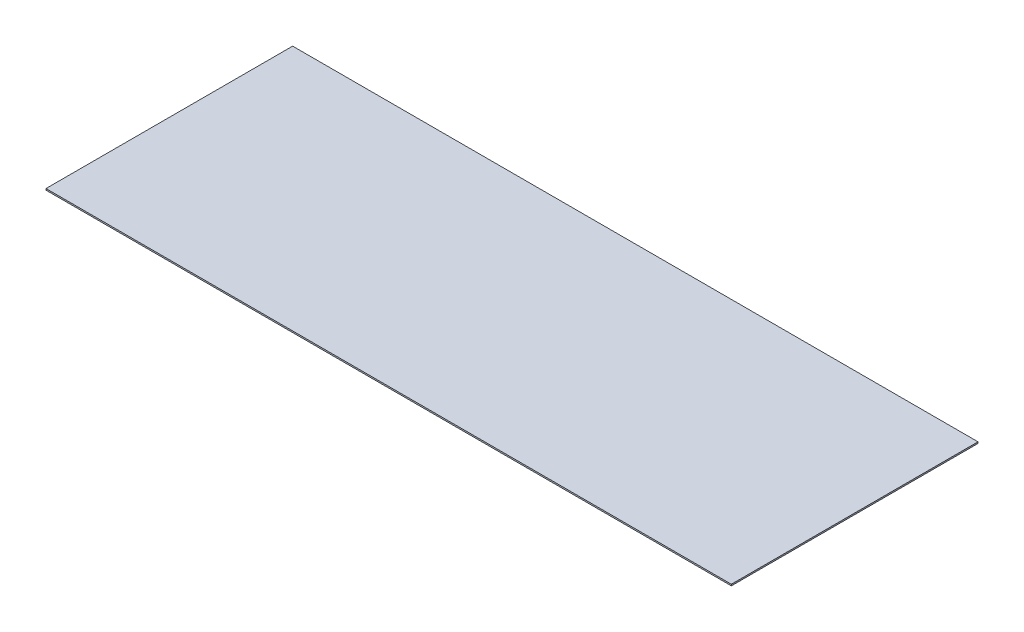
ISO-10303-21;
HEADER;
FILE_DESCRIPTION(('STEP AP214'),'2;1');
FILE_NAME('part.step','',(''),(''),'','','');
FILE_SCHEMA(('AUTOMOTIVE_DESIGN { 1 0 10303 214 1 1 1 1 }'));
ENDSEC;
DATA;
#1=APPLICATION_CONTEXT('core data for automotive mechanical design processes');
#2=APPLICATION_PROTOCOL_DEFINITION('international standard','automotive_design',2000,#1);
#3=PRODUCT_CONTEXT('',#1,'mechanical');
#4=PRODUCT('Part','Part','',(#3));
#5=PRODUCT_RELATED_PRODUCT_CATEGORY('part','',(#4));
#6=PRODUCT_DEFINITION_FORMATION('','',#4);
#7=PRODUCT_DEFINITION_CONTEXT('part definition',#1,'design');
#8=PRODUCT_DEFINITION('design','',#6,#7);
#9=PRODUCT_DEFINITION_SHAPE('','',#8);
#10=(LENGTH_UNIT() NAMED_UNIT(*) SI_UNIT(.MILLI.,.METRE.));
#11=(NAMED_UNIT(*) PLANE_ANGLE_UNIT() SI_UNIT($,.RADIAN.));
#12=(NAMED_UNIT(*) SI_UNIT($,.STERADIAN.) SOLID_ANGLE_UNIT());
#13=UNCERTAINTY_MEASURE_WITH_UNIT(LENGTH_MEASURE(1.E-05),#10,'distance_accuracy_value','');
#14=(GEOMETRIC_REPRESENTATION_CONTEXT(3) GLOBAL_UNCERTAINTY_ASSIGNED_CONTEXT((#13)) GLOBAL_UNIT_ASSIGNED_CONTEXT((#10,
#11,#12)) REPRESENTATION_CONTEXT('',''));
#15=CARTESIAN_POINT('',(0.,0.,0.));
#16=DIRECTION('',(0.,0.,1.));
#17=DIRECTION('',(1.,0.,0.));
#18=AXIS2_PLACEMENT_3D('',#15,#16,#17);
#19=CARTESIAN_POINT('',(-3.,0.,503.));
#20=DIRECTION('',(1.,0.,0.));
#21=DIRECTION('',(0.,0.,-1.));
#22=AXIS2_PLACEMENT_3D('',#19,#20,#21);
#23=PLANE('',#22);
#24=DIRECTION('',(0.,-1.,0.));
#25=VECTOR('',#24,1.);
#26=CARTESIAN_POINT('',(-3.,0.,-3.));
#27=LINE('',#26,#25);
#28=CARTESIAN_POINT('',(-3.,0.,-3.));
#29=VERTEX_POINT('',#28);
#30=CARTESIAN_POINT('',(-3.,-3.,-3.));
#31=VERTEX_POINT('',#30);
#32=EDGE_CURVE('E106',#29,#31,#27,.T.);
#33=ORIENTED_EDGE('',*,*,#32,.T.);
#34=DIRECTION('',(0.,0.,-1.));
#35=VECTOR('',#34,1.);
#36=CARTESIAN_POINT('',(-3.,-3.,503.));
#37=LINE('',#36,#35);
#38=CARTESIAN_POINT('',(-3.,-3.,503.));
#39=VERTEX_POINT('',#38);
#40=EDGE_CURVE('E11',#39,#31,#37,.T.);
#41=ORIENTED_EDGE('',*,*,#40,.F.);
#42=DIRECTION('',(0.,-1.,0.));
#43=VECTOR('',#42,1.);
#44=CARTESIAN_POINT('',(-3.,0.,503.));
#45=LINE('',#44,#43);
#46=CARTESIAN_POINT('',(-3.,0.,503.));
#47=VERTEX_POINT('',#46);
#48=EDGE_CURVE('E94',#47,#39,#45,.T.);
#49=ORIENTED_EDGE('',*,*,#48,.F.);
#50=DIRECTION('',(0.,0.,-1.));
#51=VECTOR('',#50,1.);
#52=CARTESIAN_POINT('',(-3.,0.,503.));
#53=LINE('',#52,#51);
#54=EDGE_CURVE('E102',#47,#29,#53,.T.);
#55=ORIENTED_EDGE('',*,*,#54,.T.);
#56=EDGE_LOOP('',(#33,#41,#49,#55));
#57=FACE_BOUND('',#56,.T.);
#58=ADVANCED_FACE('F43',(#57),#23,.F.);
#59=CARTESIAN_POINT('',(-3.,-3.,503.));
#60=DIRECTION('',(0.,1.,0.));
#61=DIRECTION('',(0.,0.,1.));
#62=AXIS2_PLACEMENT_3D('',#59,#60,#61);
#63=PLANE('',#62);
#64=DIRECTION('',(1.,0.,0.));
#65=VECTOR('',#64,1.);
#66=CARTESIAN_POINT('',(-3.,-3.,-3.));
#67=LINE('',#66,#65);
#68=CARTESIAN_POINT('',(1403.,-3.,-3.));
#69=VERTEX_POINT('',#68);
#70=EDGE_CURVE('E98',#31,#69,#67,.T.);
#71=ORIENTED_EDGE('',*,*,#70,.T.);
#72=DIRECTION('',(0.,0.,-1.));
#73=VECTOR('',#72,1.);
#74=CARTESIAN_POINT('',(1403.,-3.,503.));
#75=LINE('',#74,#73);
#76=CARTESIAN_POINT('',(1403.,-3.,503.));
#77=VERTEX_POINT('',#76);
#78=EDGE_CURVE('E51',#77,#69,#75,.T.);
#79=ORIENTED_EDGE('',*,*,#78,.F.);
#80=DIRECTION('',(1.,0.,0.));
#81=VECTOR('',#80,1.);
#82=CARTESIAN_POINT('',(-3.,-3.,503.));
#83=LINE('',#82,#81);
#84=EDGE_CURVE('E89',#39,#77,#83,.T.);
#85=ORIENTED_EDGE('',*,*,#84,.F.);
#86=ORIENTED_EDGE('',*,*,#40,.T.);
#87=EDGE_LOOP('',(#71,#79,#85,#86));
#88=FACE_BOUND('',#87,.T.);
#89=ADVANCED_FACE('F97',(#88),#63,.F.);
#90=CARTESIAN_POINT('',(1403.,-3.,503.));
#91=DIRECTION('',(-1.,0.,0.));
#92=DIRECTION('',(0.,0.,1.));
#93=AXIS2_PLACEMENT_3D('',#90,#91,#92);
#94=PLANE('',#93);
#95=DIRECTION('',(0.,1.,0.));
#96=VECTOR('',#95,1.);
#97=CARTESIAN_POINT('',(1403.,-3.,-3.));
#98=LINE('',#97,#96);
#99=CARTESIAN_POINT('',(1403.,0.,-3.));
#100=VERTEX_POINT('',#99);
#101=EDGE_CURVE('E76',#69,#100,#98,.T.);
#102=ORIENTED_EDGE('',*,*,#101,.T.);
#103=DIRECTION('',(0.,0.,-1.));
#104=VECTOR('',#103,1.);
#105=CARTESIAN_POINT('',(1403.,0.,503.));
#106=LINE('',#105,#104);
#107=CARTESIAN_POINT('',(1403.,0.,503.));
#108=VERTEX_POINT('',#107);
#109=EDGE_CURVE('E99',#108,#100,#106,.T.);
#110=ORIENTED_EDGE('',*,*,#109,.F.);
#111=DIRECTION('',(0.,1.,0.));
#112=VECTOR('',#111,1.);
#113=CARTESIAN_POINT('',(1403.,-3.,503.));
#114=LINE('',#113,#112);
#115=EDGE_CURVE('E92',#77,#108,#114,.T.);
#116=ORIENTED_EDGE('',*,*,#115,.F.);
#117=ORIENTED_EDGE('',*,*,#78,.T.);
#118=EDGE_LOOP('',(#102,#110,#116,#117));
#119=FACE_BOUND('',#118,.T.);
#120=ADVANCED_FACE('F100',(#119),#94,.F.);
#121=CARTESIAN_POINT('',(1403.,0.,503.));
#122=DIRECTION('',(0.,-1.,0.));
#123=DIRECTION('',(0.,0.,-1.));
#124=AXIS2_PLACEMENT_3D('',#121,#122,#123);
#125=PLANE('',#124);
#126=DIRECTION('',(-1.,0.,0.));
#127=VECTOR('',#126,1.);
#128=CARTESIAN_POINT('',(1403.,0.,-3.));
#129=LINE('',#128,#127);
#130=EDGE_CURVE('E82',#100,#29,#129,.T.);
#131=ORIENTED_EDGE('',*,*,#130,.T.);
#132=ORIENTED_EDGE('',*,*,#54,.F.);
#133=DIRECTION('',(-1.,0.,0.));
#134=VECTOR('',#133,1.);
#135=CARTESIAN_POINT('',(1403.,0.,503.));
#136=LINE('',#135,#134);
#137=EDGE_CURVE('E59',#108,#47,#136,.T.);
#138=ORIENTED_EDGE('',*,*,#137,.F.);
#139=ORIENTED_EDGE('',*,*,#109,.T.);
#140=EDGE_LOOP('',(#131,#132,#138,#139));
#141=FACE_BOUND('',#140,.T.);
#142=ADVANCED_FACE('F113',(#141),#125,.F.);
#143=CARTESIAN_POINT('',(0.,0.,503.));
#144=DIRECTION('',(0.,0.,1.));
#145=DIRECTION('',(1.,0.,0.));
#146=AXIS2_PLACEMENT_3D('',#143,#144,#145);
#147=PLANE('',#146);
#148=ORIENTED_EDGE('',*,*,#48,.T.);
#149=ORIENTED_EDGE('',*,*,#84,.T.);
#150=ORIENTED_EDGE('',*,*,#115,.T.);
#151=ORIENTED_EDGE('',*,*,#137,.T.);
#152=EDGE_LOOP('',(#148,#149,#150,#151));
#153=FACE_BOUND('',#152,.T.);
#154=ADVANCED_FACE('F90',(#153),#147,.T.);
#155=CARTESIAN_POINT('',(0.,0.,-3.));
#156=DIRECTION('',(0.,0.,1.));
#157=DIRECTION('',(1.,0.,0.));
#158=AXIS2_PLACEMENT_3D('',#155,#156,#157);
#159=PLANE('',#158);
#160=ORIENTED_EDGE('',*,*,#32,.F.);
#161=ORIENTED_EDGE('',*,*,#130,.F.);
#162=ORIENTED_EDGE('',*,*,#101,.F.);
#163=ORIENTED_EDGE('',*,*,#70,.F.);
#164=EDGE_LOOP('',(#160,#161,#162,#163));
#165=FACE_BOUND('',#164,.T.);
#166=ADVANCED_FACE('F116',(#165),#159,.F.);
#167=CLOSED_SHELL('',(#58,#89,#120,#142,#154,#166));
#168=MANIFOLD_SOLID_BREP('B2',#167);
#169=ADVANCED_BREP_SHAPE_REPRESENTATION('',(#18,#168),#14);
#170=SHAPE_DEFINITION_REPRESENTATION(#9,#169);
ENDSEC;
END-ISO-10303-21;
